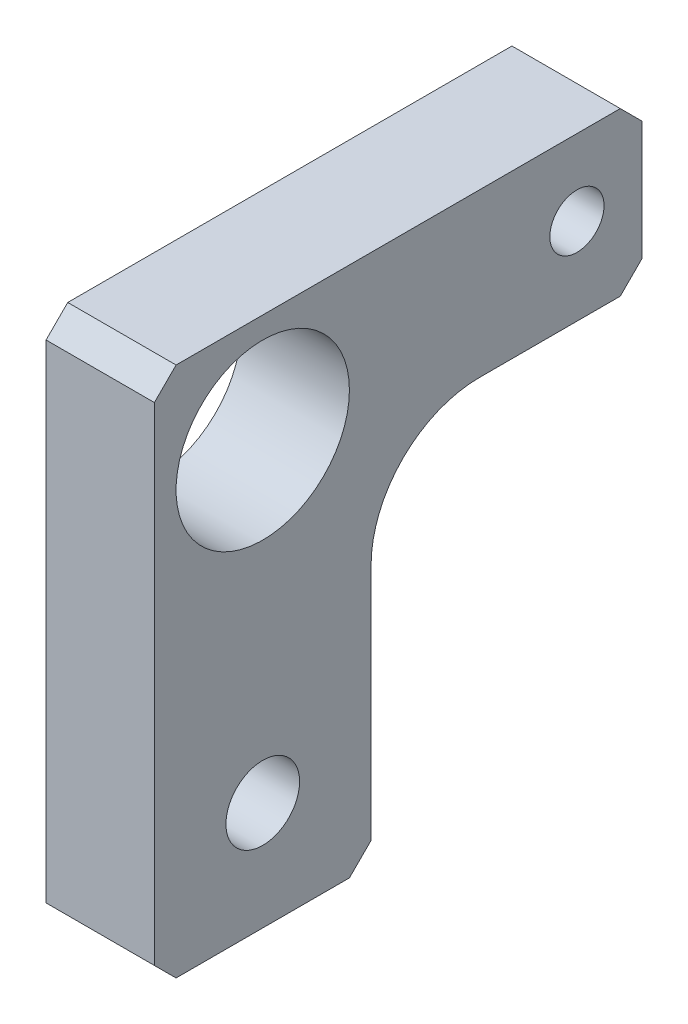
ISO-10303-21;
HEADER;
FILE_DESCRIPTION(('STEP AP214'),'2;1');
FILE_NAME('part.step','',(''),(''),'','','');
FILE_SCHEMA(('AUTOMOTIVE_DESIGN { 1 0 10303 214 1 1 1 1 }'));
ENDSEC;
DATA;
#1=APPLICATION_CONTEXT('core data for automotive mechanical design processes');
#2=APPLICATION_PROTOCOL_DEFINITION('international standard','automotive_design',2000,#1);
#3=PRODUCT_CONTEXT('',#1,'mechanical');
#4=PRODUCT('Part','Part','',(#3));
#5=PRODUCT_RELATED_PRODUCT_CATEGORY('part','',(#4));
#6=PRODUCT_DEFINITION_FORMATION('','',#4);
#7=PRODUCT_DEFINITION_CONTEXT('part definition',#1,'design');
#8=PRODUCT_DEFINITION('design','',#6,#7);
#9=PRODUCT_DEFINITION_SHAPE('','',#8);
#10=(LENGTH_UNIT() NAMED_UNIT(*) SI_UNIT(.MILLI.,.METRE.));
#11=(NAMED_UNIT(*) PLANE_ANGLE_UNIT() SI_UNIT($,.RADIAN.));
#12=(NAMED_UNIT(*) SI_UNIT($,.STERADIAN.) SOLID_ANGLE_UNIT());
#13=UNCERTAINTY_MEASURE_WITH_UNIT(LENGTH_MEASURE(1.E-05),#10,'distance_accuracy_value','');
#14=(GEOMETRIC_REPRESENTATION_CONTEXT(3) GLOBAL_UNCERTAINTY_ASSIGNED_CONTEXT((#13)) GLOBAL_UNIT_ASSIGNED_CONTEXT((#10,
#11,#12)) REPRESENTATION_CONTEXT('',''));
#15=CARTESIAN_POINT('',(0.,0.,0.));
#16=DIRECTION('',(0.,0.,1.));
#17=DIRECTION('',(1.,0.,0.));
#18=AXIS2_PLACEMENT_3D('',#15,#16,#17);
#19=CARTESIAN_POINT('',(5.,0.,0.));
#20=DIRECTION('',(0.,0.,-1.));
#21=DIRECTION('',(0.,1.,0.));
#22=AXIS2_PLACEMENT_3D('',#19,#20,#21);
#23=PLANE('',#22);
#24=DIRECTION('',(0.,-1.,0.));
#25=VECTOR('',#24,1.);
#26=CARTESIAN_POINT('',(-5.,0.,0.));
#27=LINE('',#26,#25);
#28=CARTESIAN_POINT('',(-5.,-2.,0.));
#29=VERTEX_POINT('',#28);
#30=CARTESIAN_POINT('',(-5.,-47.,0.));
#31=VERTEX_POINT('',#30);
#32=EDGE_CURVE('E166',#29,#31,#27,.T.);
#33=ORIENTED_EDGE('',*,*,#32,.T.);
#34=DIRECTION('',(1.,0.,0.));
#35=VECTOR('',#34,1.);
#36=CARTESIAN_POINT('',(5.,-47.,0.));
#37=LINE('',#36,#35);
#38=CARTESIAN_POINT('',(5.,-47.,0.));
#39=VERTEX_POINT('',#38);
#40=EDGE_CURVE('E197',#31,#39,#37,.T.);
#41=ORIENTED_EDGE('',*,*,#40,.T.);
#42=DIRECTION('',(0.,-1.,0.));
#43=VECTOR('',#42,1.);
#44=CARTESIAN_POINT('',(5.,0.,0.));
#45=LINE('',#44,#43);
#46=CARTESIAN_POINT('',(5.,-1.99999999999998,0.));
#47=VERTEX_POINT('',#46);
#48=EDGE_CURVE('E158',#47,#39,#45,.T.);
#49=ORIENTED_EDGE('',*,*,#48,.F.);
#50=DIRECTION('',(-1.,0.,0.));
#51=VECTOR('',#50,1.);
#52=CARTESIAN_POINT('',(5.,-2.,0.));
#53=LINE('',#52,#51);
#54=EDGE_CURVE('E194',#47,#29,#53,.T.);
#55=ORIENTED_EDGE('',*,*,#54,.T.);
#56=EDGE_LOOP('',(#33,#41,#49,#55));
#57=FACE_BOUND('',#56,.T.);
#58=ADVANCED_FACE('F34',(#57),#23,.F.);
#59=CARTESIAN_POINT('',(5.,-49.,0.));
#60=DIRECTION('',(0.,1.,0.));
#61=DIRECTION('',(0.,0.,1.));
#62=AXIS2_PLACEMENT_3D('',#59,#60,#61);
#63=PLANE('',#62);
#64=DIRECTION('',(0.,0.,-1.));
#65=VECTOR('',#64,1.);
#66=CARTESIAN_POINT('',(5.,-49.,0.));
#67=LINE('',#66,#65);
#68=CARTESIAN_POINT('',(5.,-49.,-2.00000000000001));
#69=VERTEX_POINT('',#68);
#70=CARTESIAN_POINT('',(5.,-49.,-18.));
#71=VERTEX_POINT('',#70);
#72=EDGE_CURVE('E160',#69,#71,#67,.T.);
#73=ORIENTED_EDGE('',*,*,#72,.F.);
#74=DIRECTION('',(-1.,0.,0.));
#75=VECTOR('',#74,1.);
#76=CARTESIAN_POINT('',(5.,-49.,-2.00000000000001));
#77=LINE('',#76,#75);
#78=CARTESIAN_POINT('',(-5.,-49.,-2.00000000000001));
#79=VERTEX_POINT('',#78);
#80=EDGE_CURVE('E181',#69,#79,#77,.T.);
#81=ORIENTED_EDGE('',*,*,#80,.T.);
#82=DIRECTION('',(0.,0.,-1.));
#83=VECTOR('',#82,1.);
#84=CARTESIAN_POINT('',(-5.,-49.,0.));
#85=LINE('',#84,#83);
#86=CARTESIAN_POINT('',(-5.,-49.,-18.));
#87=VERTEX_POINT('',#86);
#88=EDGE_CURVE('E169',#79,#87,#85,.T.);
#89=ORIENTED_EDGE('',*,*,#88,.T.);
#90=DIRECTION('',(1.,0.,0.));
#91=VECTOR('',#90,1.);
#92=CARTESIAN_POINT('',(5.,-49.,-18.));
#93=LINE('',#92,#91);
#94=EDGE_CURVE('E178',#87,#71,#93,.T.);
#95=ORIENTED_EDGE('',*,*,#94,.T.);
#96=EDGE_LOOP('',(#73,#81,#89,#95));
#97=FACE_BOUND('',#96,.T.);
#98=ADVANCED_FACE('F249',(#97),#63,.F.);
#99=CARTESIAN_POINT('',(5.,0.,-45.));
#100=DIRECTION('',(0.,0.,1.));
#101=DIRECTION('',(0.,-1.,0.));
#102=AXIS2_PLACEMENT_3D('',#99,#100,#101);
#103=PLANE('',#102);
#104=DIRECTION('',(0.,1.,0.));
#105=VECTOR('',#104,1.);
#106=CARTESIAN_POINT('',(5.,0.,-45.));
#107=LINE('',#106,#105);
#108=CARTESIAN_POINT('',(5.,-13.,-45.));
#109=VERTEX_POINT('',#108);
#110=CARTESIAN_POINT('',(5.,-2.00000000000002,-45.));
#111=VERTEX_POINT('',#110);
#112=EDGE_CURVE('E163',#109,#111,#107,.T.);
#113=ORIENTED_EDGE('',*,*,#112,.F.);
#114=DIRECTION('',(-1.,0.,0.));
#115=VECTOR('',#114,1.);
#116=CARTESIAN_POINT('',(5.,-13.,-45.));
#117=LINE('',#116,#115);
#118=CARTESIAN_POINT('',(-5.,-13.,-45.));
#119=VERTEX_POINT('',#118);
#120=EDGE_CURVE('E214',#109,#119,#117,.T.);
#121=ORIENTED_EDGE('',*,*,#120,.T.);
#122=DIRECTION('',(0.,1.,0.));
#123=VECTOR('',#122,1.);
#124=CARTESIAN_POINT('',(-5.,0.,-45.));
#125=LINE('',#124,#123);
#126=CARTESIAN_POINT('',(-5.,-2.,-45.));
#127=VERTEX_POINT('',#126);
#128=EDGE_CURVE('E172',#119,#127,#125,.T.);
#129=ORIENTED_EDGE('',*,*,#128,.T.);
#130=DIRECTION('',(1.,0.,0.));
#131=VECTOR('',#130,1.);
#132=CARTESIAN_POINT('',(5.,-2.,-45.));
#133=LINE('',#132,#131);
#134=EDGE_CURVE('E212',#127,#111,#133,.T.);
#135=ORIENTED_EDGE('',*,*,#134,.T.);
#136=EDGE_LOOP('',(#113,#121,#129,#135));
#137=FACE_BOUND('',#136,.T.);
#138=ADVANCED_FACE('F219',(#137),#103,.F.);
#139=CARTESIAN_POINT('',(5.,0.,0.));
#140=DIRECTION('',(0.,-1.,0.));
#141=DIRECTION('',(0.,0.,-1.));
#142=AXIS2_PLACEMENT_3D('',#139,#140,#141);
#143=PLANE('',#142);
#144=DIRECTION('',(0.,0.,1.));
#145=VECTOR('',#144,1.);
#146=CARTESIAN_POINT('',(5.,0.,0.));
#147=LINE('',#146,#145);
#148=CARTESIAN_POINT('',(5.,0.,-43.));
#149=VERTEX_POINT('',#148);
#150=CARTESIAN_POINT('',(5.,0.,-2.));
#151=VERTEX_POINT('',#150);
#152=EDGE_CURVE('E144',#149,#151,#147,.T.);
#153=ORIENTED_EDGE('',*,*,#152,.F.);
#154=DIRECTION('',(-1.,0.,0.));
#155=VECTOR('',#154,1.);
#156=CARTESIAN_POINT('',(5.,0.,-43.));
#157=LINE('',#156,#155);
#158=CARTESIAN_POINT('',(-5.,0.,-43.));
#159=VERTEX_POINT('',#158);
#160=EDGE_CURVE('E11',#149,#159,#157,.T.);
#161=ORIENTED_EDGE('',*,*,#160,.T.);
#162=DIRECTION('',(0.,0.,1.));
#163=VECTOR('',#162,1.);
#164=CARTESIAN_POINT('',(-5.,0.,0.));
#165=LINE('',#164,#163);
#166=CARTESIAN_POINT('',(-5.,0.,-2.00000000000001));
#167=VERTEX_POINT('',#166);
#168=EDGE_CURVE('E161',#159,#167,#165,.T.);
#169=ORIENTED_EDGE('',*,*,#168,.T.);
#170=DIRECTION('',(1.,0.,0.));
#171=VECTOR('',#170,1.);
#172=CARTESIAN_POINT('',(5.,0.,-2.00000000000001));
#173=LINE('',#172,#171);
#174=EDGE_CURVE('E42',#167,#151,#173,.T.);
#175=ORIENTED_EDGE('',*,*,#174,.T.);
#176=EDGE_LOOP('',(#153,#161,#169,#175));
#177=FACE_BOUND('',#176,.T.);
#178=ADVANCED_FACE('F235',(#177),#143,.F.);
#179=CARTESIAN_POINT('',(5.,-49.,0.));
#180=DIRECTION('',(1.,0.,0.));
#181=DIRECTION('',(0.,0.,-1.));
#182=AXIS2_PLACEMENT_3D('',#179,#180,#181);
#183=PLANE('',#182);
#184=CARTESIAN_POINT('',(5.,-7.,-39.));
#185=DIRECTION('',(1.,0.,0.));
#186=DIRECTION('',(0.,0.,-1.));
#187=AXIS2_PLACEMENT_3D('',#184,#185,#186);
#188=CIRCLE('',#187,2.49999999999999);
#189=CARTESIAN_POINT('',(5.,-7.,-41.5));
#190=VERTEX_POINT('',#189);
#191=EDGE_CURVE('E421',#190,#190,#188,.T.);
#192=ORIENTED_EDGE('',*,*,#191,.F.);
#193=EDGE_LOOP('',(#192));
#194=FACE_BOUND('',#193,.T.);
#195=CARTESIAN_POINT('',(5.,-39.,-10.));
#196=DIRECTION('',(1.,0.,0.));
#197=DIRECTION('',(0.,0.,-1.));
#198=AXIS2_PLACEMENT_3D('',#195,#196,#197);
#199=CIRCLE('',#198,3.39999999999999);
#200=CARTESIAN_POINT('',(5.,-39.,-13.4));
#201=VERTEX_POINT('',#200);
#202=EDGE_CURVE('E417',#201,#201,#199,.T.);
#203=ORIENTED_EDGE('',*,*,#202,.F.);
#204=EDGE_LOOP('',(#203));
#205=FACE_BOUND('',#204,.T.);
#206=CARTESIAN_POINT('',(5.,-10.,-10.));
#207=DIRECTION('',(1.,0.,0.));
#208=DIRECTION('',(0.,0.,-1.));
#209=AXIS2_PLACEMENT_3D('',#206,#207,#208);
#210=CIRCLE('',#209,8.);
#211=CARTESIAN_POINT('',(5.,-10.,-18.));
#212=VERTEX_POINT('',#211);
#213=EDGE_CURVE('E411',#212,#212,#210,.T.);
#214=ORIENTED_EDGE('',*,*,#213,.F.);
#215=EDGE_LOOP('',(#214));
#216=FACE_BOUND('',#215,.T.);
#217=ORIENTED_EDGE('',*,*,#48,.T.);
#218=DIRECTION('',(0.,0.707106781186549,0.707106781186546));
#219=VECTOR('',#218,1.);
#220=CARTESIAN_POINT('',(5.,-48.,-1.00000000000001));
#221=LINE('',#220,#219);
#222=EDGE_CURVE('E205',#39,#69,#221,.F.);
#223=ORIENTED_EDGE('',*,*,#222,.T.);
#224=ORIENTED_EDGE('',*,*,#72,.T.);
#225=DIRECTION('',(0.,-0.707106781186549,0.707106781186546));
#226=VECTOR('',#225,1.);
#227=CARTESIAN_POINT('',(5.,-58.,-9.00000000000003));
#228=LINE('',#227,#226);
#229=CARTESIAN_POINT('',(5.,-47.,-20.));
#230=VERTEX_POINT('',#229);
#231=EDGE_CURVE('E149',#71,#230,#228,.F.);
#232=ORIENTED_EDGE('',*,*,#231,.T.);
#233=DIRECTION('',(0.,-1.,0.));
#234=VECTOR('',#233,1.);
#235=CARTESIAN_POINT('',(5.,-49.,-20.));
#236=LINE('',#235,#234);
#237=CARTESIAN_POINT('',(5.,-25.,-20.));
#238=VERTEX_POINT('',#237);
#239=EDGE_CURVE('E140',#238,#230,#236,.T.);
#240=ORIENTED_EDGE('',*,*,#239,.F.);
#241=CARTESIAN_POINT('',(5.,-25.,-30.));
#242=DIRECTION('',(1.,0.,0.));
#243=DIRECTION('',(0.,0.,-1.));
#244=AXIS2_PLACEMENT_3D('',#241,#242,#243);
#245=CIRCLE('',#244,10.);
#246=CARTESIAN_POINT('',(5.,-15.,-30.));
#247=VERTEX_POINT('',#246);
#248=EDGE_CURVE('E125',#238,#247,#245,.F.);
#249=ORIENTED_EDGE('',*,*,#248,.T.);
#250=DIRECTION('',(0.,0.,1.));
#251=VECTOR('',#250,1.);
#252=CARTESIAN_POINT('',(5.,-15.,-45.));
#253=LINE('',#252,#251);
#254=CARTESIAN_POINT('',(5.,-15.,-43.));
#255=VERTEX_POINT('',#254);
#256=EDGE_CURVE('E151',#255,#247,#253,.T.);
#257=ORIENTED_EDGE('',*,*,#256,.F.);
#258=DIRECTION('',(0.,-0.707106781186549,0.707106781186546));
#259=VECTOR('',#258,1.);
#260=CARTESIAN_POINT('',(5.,-53.5000000000001,-4.50000000000009));
#261=LINE('',#260,#259);
#262=EDGE_CURVE('E202',#255,#109,#261,.F.);
#263=ORIENTED_EDGE('',*,*,#262,.T.);
#264=ORIENTED_EDGE('',*,*,#112,.T.);
#265=DIRECTION('',(0.,-0.70710678118655,-0.707106781186545));
#266=VECTOR('',#265,1.);
#267=CARTESIAN_POINT('',(5.,-3.00000000000018,-46.0000000000001));
#268=LINE('',#267,#266);
#269=EDGE_CURVE('E55',#111,#149,#268,.F.);
#270=ORIENTED_EDGE('',*,*,#269,.T.);
#271=ORIENTED_EDGE('',*,*,#152,.T.);
#272=DIRECTION('',(0.,0.707106781186546,-0.707106781186549));
#273=VECTOR('',#272,1.);
#274=CARTESIAN_POINT('',(5.,-25.4999999999999,23.5));
#275=LINE('',#274,#273);
#276=EDGE_CURVE('E199',#151,#47,#275,.F.);
#277=ORIENTED_EDGE('',*,*,#276,.T.);
#278=EDGE_LOOP('',(#217,#223,#224,#232,#240,#249,#257,#263,#264,#270,#271,#277));
#279=FACE_BOUND('',#278,.T.);
#280=ADVANCED_FACE('F147',(#194,#205,#216,#279),#183,.T.);
#281=CARTESIAN_POINT('',(-5.,-49.,0.));
#282=DIRECTION('',(1.,0.,0.));
#283=DIRECTION('',(0.,0.,-1.));
#284=AXIS2_PLACEMENT_3D('',#281,#282,#283);
#285=PLANE('',#284);
#286=CARTESIAN_POINT('',(-5.,-7.,-39.));
#287=DIRECTION('',(1.,0.,0.));
#288=DIRECTION('',(0.,0.,-1.));
#289=AXIS2_PLACEMENT_3D('',#286,#287,#288);
#290=CIRCLE('',#289,2.5);
#291=CARTESIAN_POINT('',(-5.,-7.,-41.5));
#292=VERTEX_POINT('',#291);
#293=EDGE_CURVE('E404',#292,#292,#290,.T.);
#294=ORIENTED_EDGE('',*,*,#293,.T.);
#295=EDGE_LOOP('',(#294));
#296=FACE_BOUND('',#295,.T.);
#297=CARTESIAN_POINT('',(-5.,-39.,-10.));
#298=DIRECTION('',(1.,0.,0.));
#299=DIRECTION('',(0.,0.,-1.));
#300=AXIS2_PLACEMENT_3D('',#297,#298,#299);
#301=CIRCLE('',#300,3.4);
#302=CARTESIAN_POINT('',(-5.,-39.,-13.4));
#303=VERTEX_POINT('',#302);
#304=EDGE_CURVE('E408',#303,#303,#301,.T.);
#305=ORIENTED_EDGE('',*,*,#304,.T.);
#306=EDGE_LOOP('',(#305));
#307=FACE_BOUND('',#306,.T.);
#308=CARTESIAN_POINT('',(-5.,-10.,-10.));
#309=DIRECTION('',(1.,0.,0.));
#310=DIRECTION('',(0.,0.,-1.));
#311=AXIS2_PLACEMENT_3D('',#308,#309,#310);
#312=CIRCLE('',#311,8.);
#313=CARTESIAN_POINT('',(-5.,-10.,-18.));
#314=VERTEX_POINT('',#313);
#315=EDGE_CURVE('E154',#314,#314,#312,.T.);
#316=ORIENTED_EDGE('',*,*,#315,.T.);
#317=EDGE_LOOP('',(#316));
#318=FACE_BOUND('',#317,.T.);
#319=ORIENTED_EDGE('',*,*,#88,.F.);
#320=DIRECTION('',(0.,-0.707106781186549,-0.707106781186546));
#321=VECTOR('',#320,1.);
#322=CARTESIAN_POINT('',(-5.,-49.,-2.00000000000001));
#323=LINE('',#322,#321);
#324=EDGE_CURVE('E192',#79,#31,#323,.F.);
#325=ORIENTED_EDGE('',*,*,#324,.T.);
#326=ORIENTED_EDGE('',*,*,#32,.F.);
#327=DIRECTION('',(0.,-0.707106781186546,0.707106781186549));
#328=VECTOR('',#327,1.);
#329=CARTESIAN_POINT('',(-5.,-2.,0.));
#330=LINE('',#329,#328);
#331=EDGE_CURVE('E184',#29,#167,#330,.F.);
#332=ORIENTED_EDGE('',*,*,#331,.T.);
#333=ORIENTED_EDGE('',*,*,#168,.F.);
#334=DIRECTION('',(0.,0.70710678118655,0.707106781186545));
#335=VECTOR('',#334,1.);
#336=CARTESIAN_POINT('',(-5.,0.,-43.));
#337=LINE('',#336,#335);
#338=EDGE_CURVE('E186',#159,#127,#337,.F.);
#339=ORIENTED_EDGE('',*,*,#338,.T.);
#340=ORIENTED_EDGE('',*,*,#128,.F.);
#341=DIRECTION('',(0.,0.707106781186549,-0.707106781186546));
#342=VECTOR('',#341,1.);
#343=CARTESIAN_POINT('',(-5.,-15.,-43.));
#344=LINE('',#343,#342);
#345=CARTESIAN_POINT('',(-5.,-15.,-43.));
#346=VERTEX_POINT('',#345);
#347=EDGE_CURVE('E188',#119,#346,#344,.F.);
#348=ORIENTED_EDGE('',*,*,#347,.T.);
#349=DIRECTION('',(0.,0.,1.));
#350=VECTOR('',#349,1.);
#351=CARTESIAN_POINT('',(-5.,-15.,-45.));
#352=LINE('',#351,#350);
#353=CARTESIAN_POINT('',(-5.,-15.,-30.));
#354=VERTEX_POINT('',#353);
#355=EDGE_CURVE('E150',#346,#354,#352,.T.);
#356=ORIENTED_EDGE('',*,*,#355,.T.);
#357=CARTESIAN_POINT('',(-5.,-25.,-30.));
#358=DIRECTION('',(1.,0.,0.));
#359=DIRECTION('',(0.,0.,-1.));
#360=AXIS2_PLACEMENT_3D('',#357,#358,#359);
#361=CIRCLE('',#360,10.);
#362=CARTESIAN_POINT('',(-5.,-25.,-20.));
#363=VERTEX_POINT('',#362);
#364=EDGE_CURVE('E134',#354,#363,#361,.T.);
#365=ORIENTED_EDGE('',*,*,#364,.T.);
#366=DIRECTION('',(0.,-1.,0.));
#367=VECTOR('',#366,1.);
#368=CARTESIAN_POINT('',(-5.,-49.,-20.));
#369=LINE('',#368,#367);
#370=CARTESIAN_POINT('',(-5.,-47.,-20.));
#371=VERTEX_POINT('',#370);
#372=EDGE_CURVE('E143',#363,#371,#369,.T.);
#373=ORIENTED_EDGE('',*,*,#372,.T.);
#374=DIRECTION('',(0.,0.707106781186549,-0.707106781186546));
#375=VECTOR('',#374,1.);
#376=CARTESIAN_POINT('',(-5.,-49.,-18.));
#377=LINE('',#376,#375);
#378=EDGE_CURVE('E190',#371,#87,#377,.F.);
#379=ORIENTED_EDGE('',*,*,#378,.T.);
#380=EDGE_LOOP('',(#319,#325,#326,#332,#333,#339,#340,#348,#356,#365,#373,#379));
#381=FACE_BOUND('',#380,.T.);
#382=ADVANCED_FACE('F225',(#296,#307,#318,#381),#285,.F.);
#383=CARTESIAN_POINT('',(-5.,-49.,-20.));
#384=DIRECTION('',(0.,0.,1.));
#385=DIRECTION('',(1.,0.,0.));
#386=AXIS2_PLACEMENT_3D('',#383,#384,#385);
#387=PLANE('',#386);
#388=ORIENTED_EDGE('',*,*,#239,.T.);
#389=DIRECTION('',(-1.,0.,0.));
#390=VECTOR('',#389,1.);
#391=CARTESIAN_POINT('',(-5.,-47.,-20.));
#392=LINE('',#391,#390);
#393=EDGE_CURVE('E207',#230,#371,#392,.T.);
#394=ORIENTED_EDGE('',*,*,#393,.T.);
#395=ORIENTED_EDGE('',*,*,#372,.F.);
#396=DIRECTION('',(1.,0.,0.));
#397=VECTOR('',#396,1.);
#398=CARTESIAN_POINT('',(5.,-25.,-20.));
#399=LINE('',#398,#397);
#400=EDGE_CURVE('E129',#363,#238,#399,.T.);
#401=ORIENTED_EDGE('',*,*,#400,.T.);
#402=EDGE_LOOP('',(#388,#394,#395,#401));
#403=FACE_BOUND('',#402,.T.);
#404=ADVANCED_FACE('F139',(#403),#387,.F.);
#405=CARTESIAN_POINT('',(-5.,-15.,-45.));
#406=DIRECTION('',(0.,1.,0.));
#407=DIRECTION('',(0.,0.,1.));
#408=AXIS2_PLACEMENT_3D('',#405,#406,#407);
#409=PLANE('',#408);
#410=ORIENTED_EDGE('',*,*,#355,.F.);
#411=DIRECTION('',(1.,0.,0.));
#412=VECTOR('',#411,1.);
#413=CARTESIAN_POINT('',(-5.,-15.,-43.));
#414=LINE('',#413,#412);
#415=EDGE_CURVE('E209',#346,#255,#414,.T.);
#416=ORIENTED_EDGE('',*,*,#415,.T.);
#417=ORIENTED_EDGE('',*,*,#256,.T.);
#418=DIRECTION('',(1.,0.,0.));
#419=VECTOR('',#418,1.);
#420=CARTESIAN_POINT('',(-5.,-15.,-30.));
#421=LINE('',#420,#419);
#422=EDGE_CURVE('E131',#247,#354,#421,.F.);
#423=ORIENTED_EDGE('',*,*,#422,.T.);
#424=EDGE_LOOP('',(#410,#416,#417,#423));
#425=FACE_BOUND('',#424,.T.);
#426=ADVANCED_FACE('F231',(#425),#409,.F.);
#427=CARTESIAN_POINT('',(-5.,-10.,-10.));
#428=DIRECTION('',(1.,0.,0.));
#429=DIRECTION('',(0.,0.,-1.));
#430=AXIS2_PLACEMENT_3D('',#427,#428,#429);
#431=CYLINDRICAL_SURFACE('',#430,8.);
#432=ORIENTED_EDGE('',*,*,#315,.F.);
#433=EDGE_LOOP('',(#432));
#434=FACE_BOUND('',#433,.T.);
#435=ORIENTED_EDGE('',*,*,#213,.T.);
#436=EDGE_LOOP('',(#435));
#437=FACE_BOUND('',#436,.T.);
#438=ADVANCED_FACE('F281',(#434,#437),#431,.F.);
#439=CARTESIAN_POINT('',(5.,-39.,-10.));
#440=DIRECTION('',(1.,0.,0.));
#441=DIRECTION('',(0.,0.,-1.));
#442=AXIS2_PLACEMENT_3D('',#439,#440,#441);
#443=CYLINDRICAL_SURFACE('',#442,3.39999999999999);
#444=ORIENTED_EDGE('',*,*,#304,.F.);
#445=EDGE_LOOP('',(#444));
#446=FACE_BOUND('',#445,.T.);
#447=ORIENTED_EDGE('',*,*,#202,.T.);
#448=EDGE_LOOP('',(#447));
#449=FACE_BOUND('',#448,.T.);
#450=ADVANCED_FACE('F275',(#446,#449),#443,.F.);
#451=CARTESIAN_POINT('',(5.,-7.,-39.));
#452=DIRECTION('',(1.,0.,0.));
#453=DIRECTION('',(0.,0.,-1.));
#454=AXIS2_PLACEMENT_3D('',#451,#452,#453);
#455=CYLINDRICAL_SURFACE('',#454,2.49999999999999);
#456=ORIENTED_EDGE('',*,*,#293,.F.);
#457=EDGE_LOOP('',(#456));
#458=FACE_BOUND('',#457,.T.);
#459=ORIENTED_EDGE('',*,*,#191,.T.);
#460=EDGE_LOOP('',(#459));
#461=FACE_BOUND('',#460,.T.);
#462=ADVANCED_FACE('F271',(#458,#461),#455,.F.);
#463=CARTESIAN_POINT('',(-5.,-25.,-30.));
#464=DIRECTION('',(-1.,0.,0.));
#465=DIRECTION('',(0.,0.,1.));
#466=AXIS2_PLACEMENT_3D('',#463,#464,#465);
#467=CYLINDRICAL_SURFACE('',#466,10.);
#468=ORIENTED_EDGE('',*,*,#364,.F.);
#469=ORIENTED_EDGE('',*,*,#422,.F.);
#470=ORIENTED_EDGE('',*,*,#248,.F.);
#471=ORIENTED_EDGE('',*,*,#400,.F.);
#472=EDGE_LOOP('',(#468,#469,#470,#471));
#473=FACE_BOUND('',#472,.T.);
#474=ADVANCED_FACE('F128',(#473),#467,.F.);
#475=CARTESIAN_POINT('',(5.,-49.,-2.00000000000001));
#476=DIRECTION('',(0.,0.707106781186546,-0.707106781186549));
#477=DIRECTION('',(0.,0.707106781186549,0.707106781186546));
#478=AXIS2_PLACEMENT_3D('',#475,#476,#477);
#479=PLANE('',#478);
#480=ORIENTED_EDGE('',*,*,#222,.F.);
#481=ORIENTED_EDGE('',*,*,#40,.F.);
#482=ORIENTED_EDGE('',*,*,#324,.F.);
#483=ORIENTED_EDGE('',*,*,#80,.F.);
#484=EDGE_LOOP('',(#480,#481,#482,#483));
#485=FACE_BOUND('',#484,.T.);
#486=ADVANCED_FACE('F247',(#485),#479,.F.);
#487=CARTESIAN_POINT('',(5.,-49.,-18.));
#488=DIRECTION('',(0.,0.707106781186546,0.707106781186549));
#489=DIRECTION('',(0.,-0.707106781186549,0.707106781186546));
#490=AXIS2_PLACEMENT_3D('',#487,#488,#489);
#491=PLANE('',#490);
#492=ORIENTED_EDGE('',*,*,#378,.F.);
#493=ORIENTED_EDGE('',*,*,#393,.F.);
#494=ORIENTED_EDGE('',*,*,#231,.F.);
#495=ORIENTED_EDGE('',*,*,#94,.F.);
#496=EDGE_LOOP('',(#492,#493,#494,#495));
#497=FACE_BOUND('',#496,.T.);
#498=ADVANCED_FACE('F253',(#497),#491,.F.);
#499=CARTESIAN_POINT('',(-5.,-15.,-43.));
#500=DIRECTION('',(0.,0.707106781186546,0.707106781186549));
#501=DIRECTION('',(0.,-0.707106781186549,0.707106781186546));
#502=AXIS2_PLACEMENT_3D('',#499,#500,#501);
#503=PLANE('',#502);
#504=ORIENTED_EDGE('',*,*,#347,.F.);
#505=ORIENTED_EDGE('',*,*,#120,.F.);
#506=ORIENTED_EDGE('',*,*,#262,.F.);
#507=ORIENTED_EDGE('',*,*,#415,.F.);
#508=EDGE_LOOP('',(#504,#505,#506,#507));
#509=FACE_BOUND('',#508,.T.);
#510=ADVANCED_FACE('F229',(#509),#503,.F.);
#511=CARTESIAN_POINT('',(5.,0.,-43.));
#512=DIRECTION('',(0.,-0.707106781186545,0.70710678118655));
#513=DIRECTION('',(0.,-0.70710678118655,-0.707106781186545));
#514=AXIS2_PLACEMENT_3D('',#511,#512,#513);
#515=PLANE('',#514);
#516=ORIENTED_EDGE('',*,*,#269,.F.);
#517=ORIENTED_EDGE('',*,*,#134,.F.);
#518=ORIENTED_EDGE('',*,*,#338,.F.);
#519=ORIENTED_EDGE('',*,*,#160,.F.);
#520=EDGE_LOOP('',(#516,#517,#518,#519));
#521=FACE_BOUND('',#520,.T.);
#522=ADVANCED_FACE('F234',(#521),#515,.F.);
#523=CARTESIAN_POINT('',(5.,-2.,0.));
#524=DIRECTION('',(0.,-0.707106781186549,-0.707106781186546));
#525=DIRECTION('',(0.,0.707106781186546,-0.707106781186549));
#526=AXIS2_PLACEMENT_3D('',#523,#524,#525);
#527=PLANE('',#526);
#528=ORIENTED_EDGE('',*,*,#276,.F.);
#529=ORIENTED_EDGE('',*,*,#174,.F.);
#530=ORIENTED_EDGE('',*,*,#331,.F.);
#531=ORIENTED_EDGE('',*,*,#54,.F.);
#532=EDGE_LOOP('',(#528,#529,#530,#531));
#533=FACE_BOUND('',#532,.T.);
#534=ADVANCED_FACE('F36',(#533),#527,.F.);
#535=CLOSED_SHELL('',(#58,#98,#138,#178,#280,#382,#404,#426,#438,#450,#462,#474,#486,#498,#510,
#522,#534));
#536=MANIFOLD_SOLID_BREP('B2',#535);
#537=ADVANCED_BREP_SHAPE_REPRESENTATION('',(#18,#536),#14);
#538=SHAPE_DEFINITION_REPRESENTATION(#9,#537);
ENDSEC;
END-ISO-10303-21;
